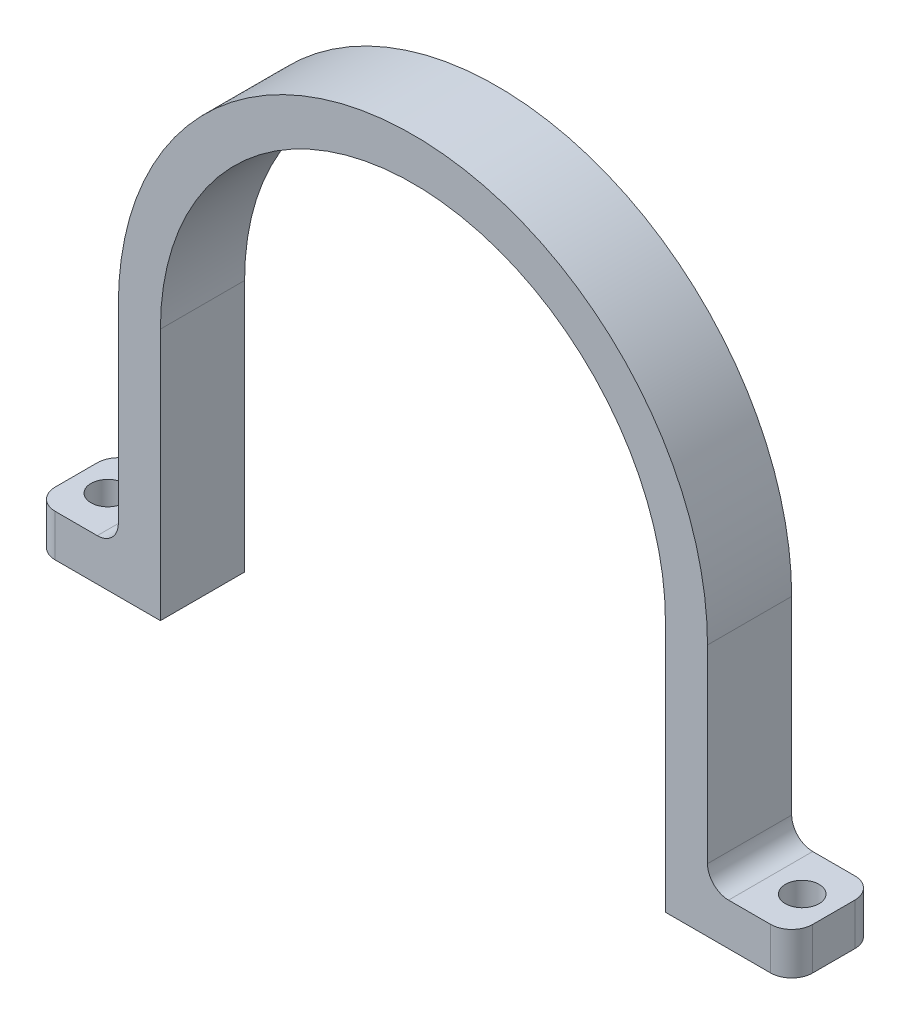
ISO-10303-21;
HEADER;
FILE_DESCRIPTION(('STEP AP214'),'2;1');
FILE_NAME('part.step','',(''),(''),'','','');
FILE_SCHEMA(('AUTOMOTIVE_DESIGN { 1 0 10303 214 1 1 1 1 }'));
ENDSEC;
DATA;
#1=APPLICATION_CONTEXT('core data for automotive mechanical design processes');
#2=APPLICATION_PROTOCOL_DEFINITION('international standard','automotive_design',2000,#1);
#3=PRODUCT_CONTEXT('',#1,'mechanical');
#4=PRODUCT('Part','Part','',(#3));
#5=PRODUCT_RELATED_PRODUCT_CATEGORY('part','',(#4));
#6=PRODUCT_DEFINITION_FORMATION('','',#4);
#7=PRODUCT_DEFINITION_CONTEXT('part definition',#1,'design');
#8=PRODUCT_DEFINITION('design','',#6,#7);
#9=PRODUCT_DEFINITION_SHAPE('','',#8);
#10=(LENGTH_UNIT() NAMED_UNIT(*) SI_UNIT(.MILLI.,.METRE.));
#11=(NAMED_UNIT(*) PLANE_ANGLE_UNIT() SI_UNIT($,.RADIAN.));
#12=(NAMED_UNIT(*) SI_UNIT($,.STERADIAN.) SOLID_ANGLE_UNIT());
#13=UNCERTAINTY_MEASURE_WITH_UNIT(LENGTH_MEASURE(1.E-05),#10,'distance_accuracy_value','');
#14=(GEOMETRIC_REPRESENTATION_CONTEXT(3) GLOBAL_UNCERTAINTY_ASSIGNED_CONTEXT((#13)) GLOBAL_UNIT_ASSIGNED_CONTEXT((#10,
#11,#12)) REPRESENTATION_CONTEXT('',''));
#15=CARTESIAN_POINT('',(0.,0.,0.));
#16=DIRECTION('',(0.,0.,1.));
#17=DIRECTION('',(1.,0.,0.));
#18=AXIS2_PLACEMENT_3D('',#15,#16,#17);
#19=CARTESIAN_POINT('',(899.999999999991,-500.000000000387,2900.));
#20=DIRECTION('',(-1.,0.,0.));
#21=DIRECTION('',(0.,0.,1.));
#22=AXIS2_PLACEMENT_3D('',#19,#20,#21);
#23=PLANE('',#22);
#24=DIRECTION('',(0.,0.,-1.));
#25=VECTOR('',#24,1.);
#26=CARTESIAN_POINT('',(899.999999999991,-600.000000000387,2900.));
#27=LINE('',#26,#25);
#28=CARTESIAN_POINT('',(899.999999999991,-600.000000000387,2850.));
#29=VERTEX_POINT('',#28);
#30=CARTESIAN_POINT('',(899.999999999991,-600.000000000387,2750.));
#31=VERTEX_POINT('',#30);
#32=EDGE_CURVE('E208',#29,#31,#27,.T.);
#33=ORIENTED_EDGE('',*,*,#32,.T.);
#34=DIRECTION('',(0.,1.,0.));
#35=VECTOR('',#34,1.);
#36=CARTESIAN_POINT('',(899.999999999991,-500.000000000387,2750.));
#37=LINE('',#36,#35);
#38=CARTESIAN_POINT('',(899.999999999991,-500.000000000387,2750.));
#39=VERTEX_POINT('',#38);
#40=EDGE_CURVE('E268',#31,#39,#37,.T.);
#41=ORIENTED_EDGE('',*,*,#40,.T.);
#42=DIRECTION('',(0.,0.,-1.));
#43=VECTOR('',#42,1.);
#44=CARTESIAN_POINT('',(899.999999999991,-500.000000000387,2900.));
#45=LINE('',#44,#43);
#46=CARTESIAN_POINT('',(899.999999999991,-500.000000000387,2850.));
#47=VERTEX_POINT('',#46);
#48=EDGE_CURVE('E178',#47,#39,#45,.T.);
#49=ORIENTED_EDGE('',*,*,#48,.F.);
#50=DIRECTION('',(0.,1.,0.));
#51=VECTOR('',#50,1.);
#52=CARTESIAN_POINT('',(899.999999999991,-600.000000000387,2850.));
#53=LINE('',#52,#51);
#54=EDGE_CURVE('E266',#47,#29,#53,.F.);
#55=ORIENTED_EDGE('',*,*,#54,.T.);
#56=EDGE_LOOP('',(#33,#41,#49,#55));
#57=FACE_BOUND('',#56,.T.);
#58=ADVANCED_FACE('F33',(#57),#23,.F.);
#59=CARTESIAN_POINT('',(750.,-500.000000000387,2900.));
#60=DIRECTION('',(0.,-1.,0.));
#61=DIRECTION('',(0.,0.,-1.));
#62=AXIS2_PLACEMENT_3D('',#59,#60,#61);
#63=PLANE('',#62);
#64=CARTESIAN_POINT('',(825.000000000005,-500.000000000387,2800.));
#65=DIRECTION('',(0.,-1.,0.));
#66=DIRECTION('',(0.,0.,1.));
#67=AXIS2_PLACEMENT_3D('',#64,#65,#66);
#68=CIRCLE('',#67,40.);
#69=CARTESIAN_POINT('',(825.000000000005,-500.000000000387,2840.));
#70=VERTEX_POINT('',#69);
#71=EDGE_CURVE('E551',#70,#70,#68,.T.);
#72=ORIENTED_EDGE('',*,*,#71,.T.);
#73=EDGE_LOOP('',(#72));
#74=FACE_BOUND('',#73,.T.);
#75=ORIENTED_EDGE('',*,*,#48,.T.);
#76=CARTESIAN_POINT('',(849.999999999991,-500.000000000387,2750.));
#77=DIRECTION('',(0.,-1.,0.));
#78=DIRECTION('',(0.,0.,-1.));
#79=AXIS2_PLACEMENT_3D('',#76,#77,#78);
#80=CIRCLE('',#79,50.);
#81=CARTESIAN_POINT('',(849.999999999991,-500.000000000387,2700.));
#82=VERTEX_POINT('',#81);
#83=EDGE_CURVE('E273',#39,#82,#80,.F.);
#84=ORIENTED_EDGE('',*,*,#83,.T.);
#85=DIRECTION('',(-1.,0.,0.));
#86=VECTOR('',#85,1.);
#87=CARTESIAN_POINT('',(750.,-500.000000000387,2700.));
#88=LINE('',#87,#86);
#89=CARTESIAN_POINT('',(750.,-500.000000000387,2700.));
#90=VERTEX_POINT('',#89);
#91=EDGE_CURVE('E175',#82,#90,#88,.T.);
#92=ORIENTED_EDGE('',*,*,#91,.T.);
#93=DIRECTION('',(0.,0.,-1.));
#94=VECTOR('',#93,1.);
#95=CARTESIAN_POINT('',(750.,-500.000000000387,2900.));
#96=LINE('',#95,#94);
#97=CARTESIAN_POINT('',(750.,-500.000000000387,2900.));
#98=VERTEX_POINT('',#97);
#99=EDGE_CURVE('E171',#98,#90,#96,.T.);
#100=ORIENTED_EDGE('',*,*,#99,.F.);
#101=DIRECTION('',(-1.,0.,0.));
#102=VECTOR('',#101,1.);
#103=CARTESIAN_POINT('',(750.,-500.000000000387,2900.));
#104=LINE('',#103,#102);
#105=CARTESIAN_POINT('',(849.999999999991,-500.000000000387,2900.));
#106=VERTEX_POINT('',#105);
#107=EDGE_CURVE('E158',#106,#98,#104,.T.);
#108=ORIENTED_EDGE('',*,*,#107,.F.);
#109=CARTESIAN_POINT('',(849.999999999991,-500.000000000387,2850.));
#110=DIRECTION('',(0.,-1.,0.));
#111=DIRECTION('',(0.,0.,-1.));
#112=AXIS2_PLACEMENT_3D('',#109,#110,#111);
#113=CIRCLE('',#112,50.);
#114=EDGE_CURVE('E271',#106,#47,#113,.F.);
#115=ORIENTED_EDGE('',*,*,#114,.T.);
#116=EDGE_LOOP('',(#75,#84,#92,#100,#108,#115));
#117=FACE_BOUND('',#116,.T.);
#118=ADVANCED_FACE('F173',(#74,#117),#63,.F.);
#119=CARTESIAN_POINT('',(750.,-450.000000000387,2900.));
#120=DIRECTION('',(0.,0.,-1.));
#121=DIRECTION('',(-1.,0.,0.));
#122=AXIS2_PLACEMENT_3D('',#119,#120,#121);
#123=CYLINDRICAL_SURFACE('',#122,50.);
#124=CARTESIAN_POINT('',(750.,-450.000000000387,2700.));
#125=DIRECTION('',(0.,0.,-1.));
#126=DIRECTION('',(-1.,0.,0.));
#127=AXIS2_PLACEMENT_3D('',#124,#125,#126);
#128=CIRCLE('',#127,50.);
#129=CARTESIAN_POINT('',(700.,-450.000000000387,2700.));
#130=VERTEX_POINT('',#129);
#131=EDGE_CURVE('E210',#90,#130,#128,.T.);
#132=ORIENTED_EDGE('',*,*,#131,.T.);
#133=DIRECTION('',(0.,0.,-1.));
#134=VECTOR('',#133,1.);
#135=CARTESIAN_POINT('',(700.,-450.000000000387,2900.));
#136=LINE('',#135,#134);
#137=CARTESIAN_POINT('',(700.,-450.000000000387,2900.));
#138=VERTEX_POINT('',#137);
#139=EDGE_CURVE('E179',#138,#130,#136,.T.);
#140=ORIENTED_EDGE('',*,*,#139,.F.);
#141=CARTESIAN_POINT('',(750.,-450.000000000387,2900.));
#142=DIRECTION('',(0.,0.,-1.));
#143=DIRECTION('',(-1.,0.,0.));
#144=AXIS2_PLACEMENT_3D('',#141,#142,#143);
#145=CIRCLE('',#144,50.);
#146=EDGE_CURVE('E163',#98,#138,#145,.T.);
#147=ORIENTED_EDGE('',*,*,#146,.F.);
#148=ORIENTED_EDGE('',*,*,#99,.T.);
#149=EDGE_LOOP('',(#132,#140,#147,#148));
#150=FACE_BOUND('',#149,.T.);
#151=ADVANCED_FACE('F181',(#150),#123,.F.);
#152=CARTESIAN_POINT('',(700.,2.21802997291814E-13,2900.));
#153=DIRECTION('',(-1.,0.,0.));
#154=DIRECTION('',(0.,0.,1.));
#155=AXIS2_PLACEMENT_3D('',#152,#153,#154);
#156=PLANE('',#155);
#157=DIRECTION('',(0.,1.,0.));
#158=VECTOR('',#157,1.);
#159=CARTESIAN_POINT('',(700.,2.21802997291814E-13,2700.));
#160=LINE('',#159,#158);
#161=CARTESIAN_POINT('',(700.,2.21802997291814E-13,2700.));
#162=VERTEX_POINT('',#161);
#163=EDGE_CURVE('E213',#130,#162,#160,.T.);
#164=ORIENTED_EDGE('',*,*,#163,.T.);
#165=DIRECTION('',(0.,0.,-1.));
#166=VECTOR('',#165,1.);
#167=CARTESIAN_POINT('',(700.,2.21802997291814E-13,2900.));
#168=LINE('',#167,#166);
#169=CARTESIAN_POINT('',(700.,2.21802997291814E-13,2900.));
#170=VERTEX_POINT('',#169);
#171=EDGE_CURVE('E261',#170,#162,#168,.T.);
#172=ORIENTED_EDGE('',*,*,#171,.F.);
#173=DIRECTION('',(0.,1.,0.));
#174=VECTOR('',#173,1.);
#175=CARTESIAN_POINT('',(700.,2.21802997291814E-13,2900.));
#176=LINE('',#175,#174);
#177=EDGE_CURVE('E184',#138,#170,#176,.T.);
#178=ORIENTED_EDGE('',*,*,#177,.F.);
#179=ORIENTED_EDGE('',*,*,#139,.T.);
#180=EDGE_LOOP('',(#164,#172,#178,#179));
#181=FACE_BOUND('',#180,.T.);
#182=ADVANCED_FACE('F348',(#181),#156,.F.);
#183=CARTESIAN_POINT('',(0.,0.,2900.));
#184=DIRECTION('',(0.,0.,-1.));
#185=DIRECTION('',(-1.,0.,0.));
#186=AXIS2_PLACEMENT_3D('',#183,#184,#185);
#187=CYLINDRICAL_SURFACE('',#186,700.);
#188=CARTESIAN_POINT('',(0.,0.,2700.));
#189=DIRECTION('',(0.,0.,1.));
#190=DIRECTION('',(1.,0.,0.));
#191=AXIS2_PLACEMENT_3D('',#188,#189,#190);
#192=CIRCLE('',#191,700.);
#193=CARTESIAN_POINT('',(-700.,-2.25137170954729E-13,2700.));
#194=VERTEX_POINT('',#193);
#195=EDGE_CURVE('E215',#162,#194,#192,.T.);
#196=ORIENTED_EDGE('',*,*,#195,.T.);
#197=DIRECTION('',(0.,0.,-1.));
#198=VECTOR('',#197,1.);
#199=CARTESIAN_POINT('',(-700.,-2.25137170954729E-13,2900.));
#200=LINE('',#199,#198);
#201=CARTESIAN_POINT('',(-700.,-2.25137170954729E-13,2900.));
#202=VERTEX_POINT('',#201);
#203=EDGE_CURVE('E258',#202,#194,#200,.T.);
#204=ORIENTED_EDGE('',*,*,#203,.F.);
#205=CARTESIAN_POINT('',(0.,0.,2900.));
#206=DIRECTION('',(0.,0.,1.));
#207=DIRECTION('',(1.,0.,0.));
#208=AXIS2_PLACEMENT_3D('',#205,#206,#207);
#209=CIRCLE('',#208,700.);
#210=EDGE_CURVE('E186',#170,#202,#209,.T.);
#211=ORIENTED_EDGE('',*,*,#210,.F.);
#212=ORIENTED_EDGE('',*,*,#171,.T.);
#213=EDGE_LOOP('',(#196,#204,#211,#212));
#214=FACE_BOUND('',#213,.T.);
#215=ADVANCED_FACE('F355',(#214),#187,.T.);
#216=CARTESIAN_POINT('',(-700.,-2.25137170954729E-13,2900.));
#217=DIRECTION('',(1.,0.,0.));
#218=DIRECTION('',(0.,1.,0.));
#219=AXIS2_PLACEMENT_3D('',#216,#217,#218);
#220=PLANE('',#219);
#221=DIRECTION('',(0.,-1.,0.));
#222=VECTOR('',#221,1.);
#223=CARTESIAN_POINT('',(-700.,-2.25137170954729E-13,2700.));
#224=LINE('',#223,#222);
#225=CARTESIAN_POINT('',(-700.,-450.000000000387,2700.));
#226=VERTEX_POINT('',#225);
#227=EDGE_CURVE('E217',#194,#226,#224,.T.);
#228=ORIENTED_EDGE('',*,*,#227,.T.);
#229=DIRECTION('',(0.,0.,-1.));
#230=VECTOR('',#229,1.);
#231=CARTESIAN_POINT('',(-700.,-450.000000000387,2900.));
#232=LINE('',#231,#230);
#233=CARTESIAN_POINT('',(-700.,-450.000000000387,2900.));
#234=VERTEX_POINT('',#233);
#235=EDGE_CURVE('E255',#234,#226,#232,.T.);
#236=ORIENTED_EDGE('',*,*,#235,.F.);
#237=DIRECTION('',(0.,-1.,0.));
#238=VECTOR('',#237,1.);
#239=CARTESIAN_POINT('',(-700.,-2.25137170954729E-13,2900.));
#240=LINE('',#239,#238);
#241=EDGE_CURVE('E191',#202,#234,#240,.T.);
#242=ORIENTED_EDGE('',*,*,#241,.F.);
#243=ORIENTED_EDGE('',*,*,#203,.T.);
#244=EDGE_LOOP('',(#228,#236,#242,#243));
#245=FACE_BOUND('',#244,.T.);
#246=ADVANCED_FACE('F358',(#245),#220,.F.);
#247=CARTESIAN_POINT('',(-750.,-450.000000000387,2900.));
#248=DIRECTION('',(0.,0.,-1.));
#249=DIRECTION('',(-1.,0.,0.));
#250=AXIS2_PLACEMENT_3D('',#247,#248,#249);
#251=CYLINDRICAL_SURFACE('',#250,50.);
#252=CARTESIAN_POINT('',(-750.,-450.000000000387,2700.));
#253=DIRECTION('',(0.,0.,-1.));
#254=DIRECTION('',(1.,0.,0.));
#255=AXIS2_PLACEMENT_3D('',#252,#253,#254);
#256=CIRCLE('',#255,50.);
#257=CARTESIAN_POINT('',(-750.,-500.000000000387,2700.));
#258=VERTEX_POINT('',#257);
#259=EDGE_CURVE('E219',#226,#258,#256,.T.);
#260=ORIENTED_EDGE('',*,*,#259,.T.);
#261=DIRECTION('',(0.,0.,-1.));
#262=VECTOR('',#261,1.);
#263=CARTESIAN_POINT('',(-750.,-500.000000000387,2900.));
#264=LINE('',#263,#262);
#265=CARTESIAN_POINT('',(-750.,-500.000000000387,2900.));
#266=VERTEX_POINT('',#265);
#267=EDGE_CURVE('E252',#266,#258,#264,.T.);
#268=ORIENTED_EDGE('',*,*,#267,.F.);
#269=CARTESIAN_POINT('',(-750.,-450.000000000387,2900.));
#270=DIRECTION('',(0.,0.,-1.));
#271=DIRECTION('',(1.,0.,0.));
#272=AXIS2_PLACEMENT_3D('',#269,#270,#271);
#273=CIRCLE('',#272,50.);
#274=EDGE_CURVE('E193',#234,#266,#273,.T.);
#275=ORIENTED_EDGE('',*,*,#274,.F.);
#276=ORIENTED_EDGE('',*,*,#235,.T.);
#277=EDGE_LOOP('',(#260,#268,#275,#276));
#278=FACE_BOUND('',#277,.T.);
#279=ADVANCED_FACE('F361',(#278),#251,.F.);
#280=CARTESIAN_POINT('',(-750.,-500.000000000387,2900.));
#281=DIRECTION('',(0.,-1.,0.));
#282=DIRECTION('',(0.,0.,-1.));
#283=AXIS2_PLACEMENT_3D('',#280,#281,#282);
#284=PLANE('',#283);
#285=CARTESIAN_POINT('',(-825.000000000005,-500.000000000387,2800.));
#286=DIRECTION('',(0.,1.,0.));
#287=DIRECTION('',(0.,0.,1.));
#288=AXIS2_PLACEMENT_3D('',#285,#286,#287);
#289=CIRCLE('',#288,40.);
#290=CARTESIAN_POINT('',(-825.000000000005,-500.000000000387,2840.));
#291=VERTEX_POINT('',#290);
#292=EDGE_CURVE('E546',#291,#291,#289,.T.);
#293=ORIENTED_EDGE('',*,*,#292,.F.);
#294=EDGE_LOOP('',(#293));
#295=FACE_BOUND('',#294,.T.);
#296=DIRECTION('',(-1.,0.,0.));
#297=VECTOR('',#296,1.);
#298=CARTESIAN_POINT('',(-750.,-500.000000000387,2700.));
#299=LINE('',#298,#297);
#300=CARTESIAN_POINT('',(-850.000000000009,-500.000000000387,2700.));
#301=VERTEX_POINT('',#300);
#302=EDGE_CURVE('E221',#258,#301,#299,.T.);
#303=ORIENTED_EDGE('',*,*,#302,.T.);
#304=CARTESIAN_POINT('',(-850.000000000009,-500.000000000387,2750.));
#305=DIRECTION('',(0.,-1.,0.));
#306=DIRECTION('',(0.,0.,-1.));
#307=AXIS2_PLACEMENT_3D('',#304,#305,#306);
#308=CIRCLE('',#307,50.);
#309=CARTESIAN_POINT('',(-900.000000000009,-500.000000000387,2750.));
#310=VERTEX_POINT('',#309);
#311=EDGE_CURVE('E11',#301,#310,#308,.F.);
#312=ORIENTED_EDGE('',*,*,#311,.T.);
#313=DIRECTION('',(0.,0.,-1.));
#314=VECTOR('',#313,1.);
#315=CARTESIAN_POINT('',(-900.000000000009,-500.000000000387,2900.));
#316=LINE('',#315,#314);
#317=CARTESIAN_POINT('',(-900.000000000009,-500.000000000387,2850.));
#318=VERTEX_POINT('',#317);
#319=EDGE_CURVE('E250',#318,#310,#316,.T.);
#320=ORIENTED_EDGE('',*,*,#319,.F.);
#321=CARTESIAN_POINT('',(-850.000000000009,-500.000000000387,2850.));
#322=DIRECTION('',(0.,-1.,0.));
#323=DIRECTION('',(0.,0.,-1.));
#324=AXIS2_PLACEMENT_3D('',#321,#322,#323);
#325=CIRCLE('',#324,50.);
#326=CARTESIAN_POINT('',(-850.000000000009,-500.000000000387,2900.));
#327=VERTEX_POINT('',#326);
#328=EDGE_CURVE('E41',#318,#327,#325,.F.);
#329=ORIENTED_EDGE('',*,*,#328,.T.);
#330=DIRECTION('',(-1.,0.,0.));
#331=VECTOR('',#330,1.);
#332=CARTESIAN_POINT('',(-750.,-500.000000000387,2900.));
#333=LINE('',#332,#331);
#334=EDGE_CURVE('E195',#266,#327,#333,.T.);
#335=ORIENTED_EDGE('',*,*,#334,.F.);
#336=ORIENTED_EDGE('',*,*,#267,.T.);
#337=EDGE_LOOP('',(#303,#312,#320,#329,#335,#336));
#338=FACE_BOUND('',#337,.T.);
#339=ADVANCED_FACE('F296',(#295,#338),#284,.F.);
#340=CARTESIAN_POINT('',(-900.000000000009,-500.000000000387,2900.));
#341=DIRECTION('',(1.,0.,0.));
#342=DIRECTION('',(0.,0.,-1.));
#343=AXIS2_PLACEMENT_3D('',#340,#341,#342);
#344=PLANE('',#343);
#345=ORIENTED_EDGE('',*,*,#319,.T.);
#346=DIRECTION('',(0.,-1.,0.));
#347=VECTOR('',#346,1.);
#348=CARTESIAN_POINT('',(-900.000000000009,-500.000000000387,2750.));
#349=LINE('',#348,#347);
#350=CARTESIAN_POINT('',(-900.000000000009,-600.000000000387,2750.));
#351=VERTEX_POINT('',#350);
#352=EDGE_CURVE('E288',#310,#351,#349,.T.);
#353=ORIENTED_EDGE('',*,*,#352,.T.);
#354=DIRECTION('',(0.,0.,-1.));
#355=VECTOR('',#354,1.);
#356=CARTESIAN_POINT('',(-900.000000000009,-600.000000000387,2900.));
#357=LINE('',#356,#355);
#358=CARTESIAN_POINT('',(-900.000000000009,-600.000000000387,2850.));
#359=VERTEX_POINT('',#358);
#360=EDGE_CURVE('E247',#359,#351,#357,.T.);
#361=ORIENTED_EDGE('',*,*,#360,.F.);
#362=DIRECTION('',(0.,-1.,0.));
#363=VECTOR('',#362,1.);
#364=CARTESIAN_POINT('',(-900.000000000009,-500.000000000387,2850.));
#365=LINE('',#364,#363);
#366=EDGE_CURVE('E53',#359,#318,#365,.F.);
#367=ORIENTED_EDGE('',*,*,#366,.T.);
#368=EDGE_LOOP('',(#345,#353,#361,#367));
#369=FACE_BOUND('',#368,.T.);
#370=ADVANCED_FACE('F305',(#369),#344,.F.);
#371=CARTESIAN_POINT('',(-600.,-600.000000000387,2900.));
#372=DIRECTION('',(0.,1.,0.));
#373=DIRECTION('',(-1.,0.,0.));
#374=AXIS2_PLACEMENT_3D('',#371,#372,#373);
#375=PLANE('',#374);
#376=CARTESIAN_POINT('',(-825.000000000005,-600.000000000387,2800.));
#377=DIRECTION('',(0.,1.,0.));
#378=DIRECTION('',(0.,0.,1.));
#379=AXIS2_PLACEMENT_3D('',#376,#377,#378);
#380=CIRCLE('',#379,40.);
#381=CARTESIAN_POINT('',(-825.000000000005,-600.000000000387,2840.));
#382=VERTEX_POINT('',#381);
#383=EDGE_CURVE('E211',#382,#382,#380,.T.);
#384=ORIENTED_EDGE('',*,*,#383,.T.);
#385=EDGE_LOOP('',(#384));
#386=FACE_BOUND('',#385,.T.);
#387=ORIENTED_EDGE('',*,*,#360,.T.);
#388=CARTESIAN_POINT('',(-850.000000000009,-600.000000000387,2750.));
#389=DIRECTION('',(0.,1.,0.));
#390=DIRECTION('',(-1.,0.,0.));
#391=AXIS2_PLACEMENT_3D('',#388,#389,#390);
#392=CIRCLE('',#391,50.);
#393=CARTESIAN_POINT('',(-850.000000000009,-600.000000000387,2700.));
#394=VERTEX_POINT('',#393);
#395=EDGE_CURVE('E293',#351,#394,#392,.F.);
#396=ORIENTED_EDGE('',*,*,#395,.T.);
#397=DIRECTION('',(1.,0.,0.));
#398=VECTOR('',#397,1.);
#399=CARTESIAN_POINT('',(-600.,-600.000000000387,2700.));
#400=LINE('',#399,#398);
#401=CARTESIAN_POINT('',(-600.,-600.000000000387,2700.));
#402=VERTEX_POINT('',#401);
#403=EDGE_CURVE('E223',#394,#402,#400,.T.);
#404=ORIENTED_EDGE('',*,*,#403,.T.);
#405=DIRECTION('',(0.,0.,-1.));
#406=VECTOR('',#405,1.);
#407=CARTESIAN_POINT('',(-600.,-600.000000000387,2900.));
#408=LINE('',#407,#406);
#409=CARTESIAN_POINT('',(-600.,-600.000000000387,2900.));
#410=VERTEX_POINT('',#409);
#411=EDGE_CURVE('E244',#410,#402,#408,.T.);
#412=ORIENTED_EDGE('',*,*,#411,.F.);
#413=DIRECTION('',(1.,0.,0.));
#414=VECTOR('',#413,1.);
#415=CARTESIAN_POINT('',(-600.,-600.000000000387,2900.));
#416=LINE('',#415,#414);
#417=CARTESIAN_POINT('',(-850.000000000009,-600.000000000387,2900.));
#418=VERTEX_POINT('',#417);
#419=EDGE_CURVE('E198',#418,#410,#416,.T.);
#420=ORIENTED_EDGE('',*,*,#419,.F.);
#421=CARTESIAN_POINT('',(-850.000000000009,-600.000000000387,2850.));
#422=DIRECTION('',(0.,1.,0.));
#423=DIRECTION('',(-1.,0.,0.));
#424=AXIS2_PLACEMENT_3D('',#421,#422,#423);
#425=CIRCLE('',#424,50.);
#426=EDGE_CURVE('E291',#418,#359,#425,.F.);
#427=ORIENTED_EDGE('',*,*,#426,.T.);
#428=EDGE_LOOP('',(#387,#396,#404,#412,#420,#427));
#429=FACE_BOUND('',#428,.T.);
#430=ADVANCED_FACE('F303',(#386,#429),#375,.F.);
#431=CARTESIAN_POINT('',(-600.,-2.41586688783755E-13,2900.));
#432=DIRECTION('',(-1.,0.,0.));
#433=DIRECTION('',(0.,-1.,0.));
#434=AXIS2_PLACEMENT_3D('',#431,#432,#433);
#435=PLANE('',#434);
#436=DIRECTION('',(0.,1.,0.));
#437=VECTOR('',#436,1.);
#438=CARTESIAN_POINT('',(-600.,-2.41586688783755E-13,2700.));
#439=LINE('',#438,#437);
#440=CARTESIAN_POINT('',(-600.,-1.92974717961196E-13,2700.));
#441=VERTEX_POINT('',#440);
#442=EDGE_CURVE('E225',#402,#441,#439,.T.);
#443=ORIENTED_EDGE('',*,*,#442,.T.);
#444=DIRECTION('',(0.,0.,-1.));
#445=VECTOR('',#444,1.);
#446=CARTESIAN_POINT('',(-600.,-1.92974717961196E-13,2900.));
#447=LINE('',#446,#445);
#448=CARTESIAN_POINT('',(-600.,-1.92974717961196E-13,2900.));
#449=VERTEX_POINT('',#448);
#450=EDGE_CURVE('E241',#449,#441,#447,.T.);
#451=ORIENTED_EDGE('',*,*,#450,.F.);
#452=DIRECTION('',(0.,1.,0.));
#453=VECTOR('',#452,1.);
#454=CARTESIAN_POINT('',(-600.,-2.41586688783755E-13,2900.));
#455=LINE('',#454,#453);
#456=EDGE_CURVE('E200',#410,#449,#455,.T.);
#457=ORIENTED_EDGE('',*,*,#456,.F.);
#458=ORIENTED_EDGE('',*,*,#411,.T.);
#459=EDGE_LOOP('',(#443,#451,#457,#458));
#460=FACE_BOUND('',#459,.T.);
#461=ADVANCED_FACE('F319',(#460),#435,.F.);
#462=CARTESIAN_POINT('',(0.,0.,2900.));
#463=DIRECTION('',(0.,0.,-1.));
#464=DIRECTION('',(-1.,0.,0.));
#465=AXIS2_PLACEMENT_3D('',#462,#463,#464);
#466=CYLINDRICAL_SURFACE('',#465,600.);
#467=CARTESIAN_POINT('',(0.,0.,2700.));
#468=DIRECTION('',(0.,0.,-1.));
#469=DIRECTION('',(1.,0.,0.));
#470=AXIS2_PLACEMENT_3D('',#467,#468,#469);
#471=CIRCLE('',#470,600.);
#472=CARTESIAN_POINT('',(600.,2.21802997291814E-13,2700.));
#473=VERTEX_POINT('',#472);
#474=EDGE_CURVE('E227',#441,#473,#471,.T.);
#475=ORIENTED_EDGE('',*,*,#474,.T.);
#476=DIRECTION('',(0.,0.,-1.));
#477=VECTOR('',#476,1.);
#478=CARTESIAN_POINT('',(600.,2.21802997291814E-13,2900.));
#479=LINE('',#478,#477);
#480=CARTESIAN_POINT('',(600.,2.21802997291814E-13,2900.));
#481=VERTEX_POINT('',#480);
#482=EDGE_CURVE('E238',#481,#473,#479,.T.);
#483=ORIENTED_EDGE('',*,*,#482,.F.);
#484=CARTESIAN_POINT('',(0.,0.,2900.));
#485=DIRECTION('',(0.,0.,-1.));
#486=DIRECTION('',(1.,0.,0.));
#487=AXIS2_PLACEMENT_3D('',#484,#485,#486);
#488=CIRCLE('',#487,600.);
#489=EDGE_CURVE('E202',#449,#481,#488,.T.);
#490=ORIENTED_EDGE('',*,*,#489,.F.);
#491=ORIENTED_EDGE('',*,*,#450,.T.);
#492=EDGE_LOOP('',(#475,#483,#490,#491));
#493=FACE_BOUND('',#492,.T.);
#494=ADVANCED_FACE('F323',(#493),#466,.F.);
#495=CARTESIAN_POINT('',(600.,2.21802997291814E-13,2900.));
#496=DIRECTION('',(1.,0.,0.));
#497=DIRECTION('',(0.,1.,0.));
#498=AXIS2_PLACEMENT_3D('',#495,#496,#497);
#499=PLANE('',#498);
#500=DIRECTION('',(0.,-1.,0.));
#501=VECTOR('',#500,1.);
#502=CARTESIAN_POINT('',(600.,2.21802997291814E-13,2700.));
#503=LINE('',#502,#501);
#504=CARTESIAN_POINT('',(600.,-600.000000000387,2700.));
#505=VERTEX_POINT('',#504);
#506=EDGE_CURVE('E229',#473,#505,#503,.T.);
#507=ORIENTED_EDGE('',*,*,#506,.T.);
#508=DIRECTION('',(0.,0.,-1.));
#509=VECTOR('',#508,1.);
#510=CARTESIAN_POINT('',(600.,-600.000000000387,2900.));
#511=LINE('',#510,#509);
#512=CARTESIAN_POINT('',(600.,-600.000000000387,2900.));
#513=VERTEX_POINT('',#512);
#514=EDGE_CURVE('E235',#513,#505,#511,.T.);
#515=ORIENTED_EDGE('',*,*,#514,.F.);
#516=DIRECTION('',(0.,-1.,0.));
#517=VECTOR('',#516,1.);
#518=CARTESIAN_POINT('',(600.,2.21802997291814E-13,2900.));
#519=LINE('',#518,#517);
#520=EDGE_CURVE('E204',#481,#513,#519,.T.);
#521=ORIENTED_EDGE('',*,*,#520,.F.);
#522=ORIENTED_EDGE('',*,*,#482,.T.);
#523=EDGE_LOOP('',(#507,#515,#521,#522));
#524=FACE_BOUND('',#523,.T.);
#525=ADVANCED_FACE('F329',(#524),#499,.F.);
#526=CARTESIAN_POINT('',(600.,-600.000000000387,2900.));
#527=DIRECTION('',(0.,1.,0.));
#528=DIRECTION('',(0.,0.,1.));
#529=AXIS2_PLACEMENT_3D('',#526,#527,#528);
#530=PLANE('',#529);
#531=CARTESIAN_POINT('',(825.000000000005,-600.000000000387,2800.));
#532=DIRECTION('',(0.,-1.,0.));
#533=DIRECTION('',(0.,0.,1.));
#534=AXIS2_PLACEMENT_3D('',#531,#532,#533);
#535=CIRCLE('',#534,40.);
#536=CARTESIAN_POINT('',(825.000000000005,-600.000000000387,2840.));
#537=VERTEX_POINT('',#536);
#538=EDGE_CURVE('E549',#537,#537,#535,.T.);
#539=ORIENTED_EDGE('',*,*,#538,.F.);
#540=EDGE_LOOP('',(#539));
#541=FACE_BOUND('',#540,.T.);
#542=DIRECTION('',(1.,0.,0.));
#543=VECTOR('',#542,1.);
#544=CARTESIAN_POINT('',(600.,-600.000000000387,2700.));
#545=LINE('',#544,#543);
#546=CARTESIAN_POINT('',(849.999999999991,-600.000000000387,2700.));
#547=VERTEX_POINT('',#546);
#548=EDGE_CURVE('E168',#505,#547,#545,.T.);
#549=ORIENTED_EDGE('',*,*,#548,.T.);
#550=CARTESIAN_POINT('',(849.999999999991,-600.000000000387,2750.));
#551=DIRECTION('',(0.,1.,0.));
#552=DIRECTION('',(0.,0.,1.));
#553=AXIS2_PLACEMENT_3D('',#550,#551,#552);
#554=CIRCLE('',#553,50.);
#555=EDGE_CURVE('E281',#547,#31,#554,.F.);
#556=ORIENTED_EDGE('',*,*,#555,.T.);
#557=ORIENTED_EDGE('',*,*,#32,.F.);
#558=CARTESIAN_POINT('',(849.999999999991,-600.000000000387,2850.));
#559=DIRECTION('',(0.,1.,0.));
#560=DIRECTION('',(0.,0.,1.));
#561=AXIS2_PLACEMENT_3D('',#558,#559,#560);
#562=CIRCLE('',#561,50.);
#563=CARTESIAN_POINT('',(849.999999999991,-600.000000000387,2900.));
#564=VERTEX_POINT('',#563);
#565=EDGE_CURVE('E279',#29,#564,#562,.F.);
#566=ORIENTED_EDGE('',*,*,#565,.T.);
#567=DIRECTION('',(1.,0.,0.));
#568=VECTOR('',#567,1.);
#569=CARTESIAN_POINT('',(600.,-600.000000000387,2900.));
#570=LINE('',#569,#568);
#571=EDGE_CURVE('E206',#513,#564,#570,.T.);
#572=ORIENTED_EDGE('',*,*,#571,.F.);
#573=ORIENTED_EDGE('',*,*,#514,.T.);
#574=EDGE_LOOP('',(#549,#556,#557,#566,#572,#573));
#575=FACE_BOUND('',#574,.T.);
#576=ADVANCED_FACE('F332',(#541,#575),#530,.F.);
#577=CARTESIAN_POINT('',(0.,0.,2900.));
#578=DIRECTION('',(0.,0.,1.));
#579=DIRECTION('',(1.,0.,0.));
#580=AXIS2_PLACEMENT_3D('',#577,#578,#579);
#581=PLANE('',#580);
#582=ORIENTED_EDGE('',*,*,#571,.T.);
#583=DIRECTION('',(0.,1.,0.));
#584=VECTOR('',#583,1.);
#585=CARTESIAN_POINT('',(849.999999999991,-500.000000000387,2900.));
#586=LINE('',#585,#584);
#587=EDGE_CURVE('E166',#564,#106,#586,.T.);
#588=ORIENTED_EDGE('',*,*,#587,.T.);
#589=ORIENTED_EDGE('',*,*,#107,.T.);
#590=ORIENTED_EDGE('',*,*,#146,.T.);
#591=ORIENTED_EDGE('',*,*,#177,.T.);
#592=ORIENTED_EDGE('',*,*,#210,.T.);
#593=ORIENTED_EDGE('',*,*,#241,.T.);
#594=ORIENTED_EDGE('',*,*,#274,.T.);
#595=ORIENTED_EDGE('',*,*,#334,.T.);
#596=DIRECTION('',(0.,-1.,0.));
#597=VECTOR('',#596,1.);
#598=CARTESIAN_POINT('',(-850.000000000009,-600.000000000387,2900.));
#599=LINE('',#598,#597);
#600=EDGE_CURVE('E283',#327,#418,#599,.T.);
#601=ORIENTED_EDGE('',*,*,#600,.T.);
#602=ORIENTED_EDGE('',*,*,#419,.T.);
#603=ORIENTED_EDGE('',*,*,#456,.T.);
#604=ORIENTED_EDGE('',*,*,#489,.T.);
#605=ORIENTED_EDGE('',*,*,#520,.T.);
#606=EDGE_LOOP('',(#582,#588,#589,#590,#591,#592,#593,#594,#595,#601,#602,#603,#604,#605));
#607=FACE_BOUND('',#606,.T.);
#608=ADVANCED_FACE('F161',(#607),#581,.T.);
#609=CARTESIAN_POINT('',(0.,0.,2700.));
#610=DIRECTION('',(0.,0.,1.));
#611=DIRECTION('',(1.,0.,0.));
#612=AXIS2_PLACEMENT_3D('',#609,#610,#611);
#613=PLANE('',#612);
#614=ORIENTED_EDGE('',*,*,#91,.F.);
#615=DIRECTION('',(0.,1.,0.));
#616=VECTOR('',#615,1.);
#617=CARTESIAN_POINT('',(849.999999999991,0.,2700.));
#618=LINE('',#617,#616);
#619=EDGE_CURVE('E277',#82,#547,#618,.F.);
#620=ORIENTED_EDGE('',*,*,#619,.T.);
#621=ORIENTED_EDGE('',*,*,#548,.F.);
#622=ORIENTED_EDGE('',*,*,#506,.F.);
#623=ORIENTED_EDGE('',*,*,#474,.F.);
#624=ORIENTED_EDGE('',*,*,#442,.F.);
#625=ORIENTED_EDGE('',*,*,#403,.F.);
#626=DIRECTION('',(0.,-1.,0.));
#627=VECTOR('',#626,1.);
#628=CARTESIAN_POINT('',(-850.000000000009,0.,2700.));
#629=LINE('',#628,#627);
#630=EDGE_CURVE('E275',#394,#301,#629,.F.);
#631=ORIENTED_EDGE('',*,*,#630,.T.);
#632=ORIENTED_EDGE('',*,*,#302,.F.);
#633=ORIENTED_EDGE('',*,*,#259,.F.);
#634=ORIENTED_EDGE('',*,*,#227,.F.);
#635=ORIENTED_EDGE('',*,*,#195,.F.);
#636=ORIENTED_EDGE('',*,*,#163,.F.);
#637=ORIENTED_EDGE('',*,*,#131,.F.);
#638=EDGE_LOOP('',(#614,#620,#621,#622,#623,#624,#625,#631,#632,#633,#634,#635,#636,#637));
#639=FACE_BOUND('',#638,.T.);
#640=ADVANCED_FACE('F313',(#639),#613,.F.);
#641=CARTESIAN_POINT('',(-825.000000000005,-600.000000000387,2800.));
#642=DIRECTION('',(0.,1.,0.));
#643=DIRECTION('',(0.,0.,1.));
#644=AXIS2_PLACEMENT_3D('',#641,#642,#643);
#645=CYLINDRICAL_SURFACE('',#644,40.);
#646=ORIENTED_EDGE('',*,*,#383,.F.);
#647=EDGE_LOOP('',(#646));
#648=FACE_BOUND('',#647,.T.);
#649=ORIENTED_EDGE('',*,*,#292,.T.);
#650=EDGE_LOOP('',(#649));
#651=FACE_BOUND('',#650,.T.);
#652=ADVANCED_FACE('F417',(#648,#651),#645,.F.);
#653=CARTESIAN_POINT('',(825.000000000005,-600.000000000387,2800.));
#654=DIRECTION('',(0.,1.,0.));
#655=DIRECTION('',(0.,0.,1.));
#656=AXIS2_PLACEMENT_3D('',#653,#654,#655);
#657=CYLINDRICAL_SURFACE('',#656,40.);
#658=ORIENTED_EDGE('',*,*,#538,.T.);
#659=EDGE_LOOP('',(#658));
#660=FACE_BOUND('',#659,.T.);
#661=ORIENTED_EDGE('',*,*,#71,.F.);
#662=EDGE_LOOP('',(#661));
#663=FACE_BOUND('',#662,.T.);
#664=ADVANCED_FACE('F382',(#660,#663),#657,.F.);
#665=CARTESIAN_POINT('',(849.999999999991,-500.000000000387,2750.));
#666=DIRECTION('',(0.,1.,0.));
#667=DIRECTION('',(0.,0.,1.));
#668=AXIS2_PLACEMENT_3D('',#665,#666,#667);
#669=CYLINDRICAL_SURFACE('',#668,50.);
#670=ORIENTED_EDGE('',*,*,#555,.F.);
#671=ORIENTED_EDGE('',*,*,#619,.F.);
#672=ORIENTED_EDGE('',*,*,#83,.F.);
#673=ORIENTED_EDGE('',*,*,#40,.F.);
#674=EDGE_LOOP('',(#670,#671,#672,#673));
#675=FACE_BOUND('',#674,.T.);
#676=ADVANCED_FACE('F343',(#675),#669,.T.);
#677=CARTESIAN_POINT('',(849.999999999991,0.,2850.));
#678=DIRECTION('',(0.,-1.,0.));
#679=DIRECTION('',(0.,0.,-1.));
#680=AXIS2_PLACEMENT_3D('',#677,#678,#679);
#681=CYLINDRICAL_SURFACE('',#680,50.);
#682=ORIENTED_EDGE('',*,*,#565,.F.);
#683=ORIENTED_EDGE('',*,*,#54,.F.);
#684=ORIENTED_EDGE('',*,*,#114,.F.);
#685=ORIENTED_EDGE('',*,*,#587,.F.);
#686=EDGE_LOOP('',(#682,#683,#684,#685));
#687=FACE_BOUND('',#686,.T.);
#688=ADVANCED_FACE('F337',(#687),#681,.T.);
#689=CARTESIAN_POINT('',(-850.000000000009,-500.000000000387,2750.));
#690=DIRECTION('',(0.,-1.,0.));
#691=DIRECTION('',(0.,0.,-1.));
#692=AXIS2_PLACEMENT_3D('',#689,#690,#691);
#693=CYLINDRICAL_SURFACE('',#692,50.);
#694=ORIENTED_EDGE('',*,*,#311,.F.);
#695=ORIENTED_EDGE('',*,*,#630,.F.);
#696=ORIENTED_EDGE('',*,*,#395,.F.);
#697=ORIENTED_EDGE('',*,*,#352,.F.);
#698=EDGE_LOOP('',(#694,#695,#696,#697));
#699=FACE_BOUND('',#698,.T.);
#700=ADVANCED_FACE('F308',(#699),#693,.T.);
#701=CARTESIAN_POINT('',(-850.000000000009,0.,2850.));
#702=DIRECTION('',(0.,1.,0.));
#703=DIRECTION('',(0.,0.,1.));
#704=AXIS2_PLACEMENT_3D('',#701,#702,#703);
#705=CYLINDRICAL_SURFACE('',#704,50.);
#706=ORIENTED_EDGE('',*,*,#328,.F.);
#707=ORIENTED_EDGE('',*,*,#366,.F.);
#708=ORIENTED_EDGE('',*,*,#426,.F.);
#709=ORIENTED_EDGE('',*,*,#600,.F.);
#710=EDGE_LOOP('',(#706,#707,#708,#709));
#711=FACE_BOUND('',#710,.T.);
#712=ADVANCED_FACE('F35',(#711),#705,.T.);
#713=CLOSED_SHELL('',(#58,#118,#151,#182,#215,#246,#279,#339,#370,#430,#461,#494,#525,#576,#608,
#640,#652,#664,#676,#688,#700,#712));
#714=MANIFOLD_SOLID_BREP('B2',#713);
#715=ADVANCED_BREP_SHAPE_REPRESENTATION('',(#18,#714),#14);
#716=SHAPE_DEFINITION_REPRESENTATION(#9,#715);
ENDSEC;
END-ISO-10303-21;
